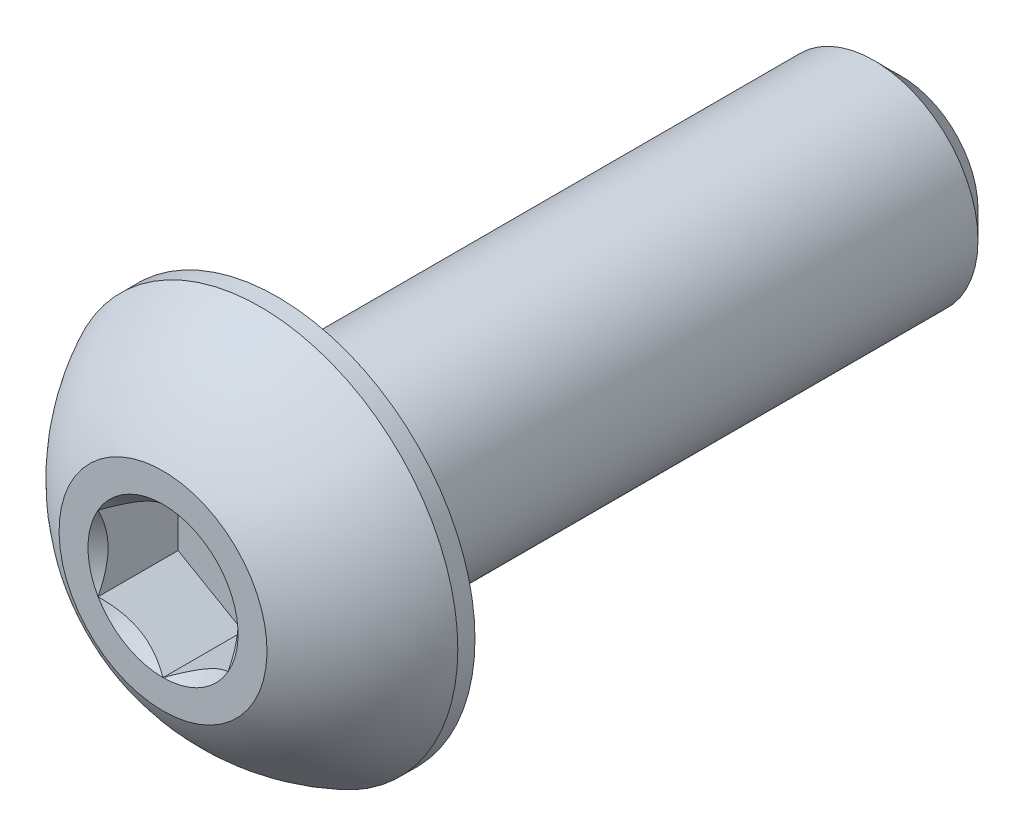
ISO-10303-21;
HEADER;
FILE_DESCRIPTION(('STEP AP214'),'2;1');
FILE_NAME('part.step','',(''),(''),'','','');
FILE_SCHEMA(('AUTOMOTIVE_DESIGN { 1 0 10303 214 1 1 1 1 }'));
ENDSEC;
DATA;
#1=APPLICATION_CONTEXT('core data for automotive mechanical design processes');
#2=APPLICATION_PROTOCOL_DEFINITION('international standard','automotive_design',2000,#1);
#3=PRODUCT_CONTEXT('',#1,'mechanical');
#4=PRODUCT('Part','Part','',(#3));
#5=PRODUCT_RELATED_PRODUCT_CATEGORY('part','',(#4));
#6=PRODUCT_DEFINITION_FORMATION('','',#4);
#7=PRODUCT_DEFINITION_CONTEXT('part definition',#1,'design');
#8=PRODUCT_DEFINITION('design','',#6,#7);
#9=PRODUCT_DEFINITION_SHAPE('','',#8);
#10=(LENGTH_UNIT() NAMED_UNIT(*) SI_UNIT(.MILLI.,.METRE.));
#11=(NAMED_UNIT(*) PLANE_ANGLE_UNIT() SI_UNIT($,.RADIAN.));
#12=(NAMED_UNIT(*) SI_UNIT($,.STERADIAN.) SOLID_ANGLE_UNIT());
#13=UNCERTAINTY_MEASURE_WITH_UNIT(LENGTH_MEASURE(1.E-05),#10,'distance_accuracy_value','');
#14=(GEOMETRIC_REPRESENTATION_CONTEXT(3) GLOBAL_UNCERTAINTY_ASSIGNED_CONTEXT((#13)) GLOBAL_UNIT_ASSIGNED_CONTEXT((#10,
#11,#12)) REPRESENTATION_CONTEXT('',''));
#15=CARTESIAN_POINT('',(0.,0.,0.));
#16=DIRECTION('',(0.,0.,1.));
#17=DIRECTION('',(1.,0.,0.));
#18=AXIS2_PLACEMENT_3D('',#15,#16,#17);
#19=CARTESIAN_POINT('',(0.,0.,-14.2));
#20=DIRECTION('',(0.,0.,1.));
#21=DIRECTION('',(1.,0.,0.));
#22=AXIS2_PLACEMENT_3D('',#19,#20,#21);
#23=PLANE('',#22);
#24=CARTESIAN_POINT('',(0.,0.,-14.2));
#25=DIRECTION('',(0.,0.,1.));
#26=DIRECTION('',(1.,0.,0.));
#27=AXIS2_PLACEMENT_3D('',#24,#25,#26);
#28=CIRCLE('',#27,1.47500000000003);
#29=CARTESIAN_POINT('',(1.47500000000003,0.,-14.2));
#30=VERTEX_POINT('',#29);
#31=EDGE_CURVE('E45',#30,#30,#28,.T.);
#32=ORIENTED_EDGE('',*,*,#31,.F.);
#33=EDGE_LOOP('',(#32));
#34=FACE_BOUND('',#33,.T.);
#35=ADVANCED_FACE('F42',(#34),#23,.F.);
#36=CARTESIAN_POINT('',(0.,0.,-14.2));
#37=DIRECTION('',(0.,0.,1.));
#38=DIRECTION('',(1.,0.,0.));
#39=AXIS2_PLACEMENT_3D('',#36,#37,#38);
#40=CONICAL_SURFACE('',#39,1.47500000000003,0.785398163397435);
#41=CARTESIAN_POINT('',(0.,0.,-13.675));
#42=DIRECTION('',(0.,0.,1.));
#43=DIRECTION('',(1.,0.,0.));
#44=AXIS2_PLACEMENT_3D('',#41,#42,#43);
#45=CIRCLE('',#44,2.00000000000001);
#46=CARTESIAN_POINT('',(2.00000000000001,0.,-13.675));
#47=VERTEX_POINT('',#46);
#48=EDGE_CURVE('E138',#47,#47,#45,.T.);
#49=ORIENTED_EDGE('',*,*,#48,.F.);
#50=EDGE_LOOP('',(#49));
#51=FACE_BOUND('',#50,.T.);
#52=ORIENTED_EDGE('',*,*,#31,.T.);
#53=EDGE_LOOP('',(#52));
#54=FACE_BOUND('',#53,.T.);
#55=ADVANCED_FACE('F159',(#51,#54),#40,.T.);
#56=CARTESIAN_POINT('',(0.,0.,0.));
#57=DIRECTION('',(0.,0.,1.));
#58=DIRECTION('',(1.,0.,0.));
#59=AXIS2_PLACEMENT_3D('',#56,#57,#58);
#60=CYLINDRICAL_SURFACE('',#59,2.00000000000001);
#61=CARTESIAN_POINT('',(0.,0.,-2.2));
#62=DIRECTION('',(0.,0.,1.));
#63=DIRECTION('',(1.,0.,0.));
#64=AXIS2_PLACEMENT_3D('',#61,#62,#63);
#65=CIRCLE('',#64,2.00000000000001);
#66=CARTESIAN_POINT('',(2.00000000000001,0.,-2.2));
#67=VERTEX_POINT('',#66);
#68=EDGE_CURVE('E12',#67,#67,#65,.T.);
#69=ORIENTED_EDGE('',*,*,#68,.F.);
#70=EDGE_LOOP('',(#69));
#71=FACE_BOUND('',#70,.T.);
#72=ORIENTED_EDGE('',*,*,#48,.T.);
#73=EDGE_LOOP('',(#72));
#74=FACE_BOUND('',#73,.T.);
#75=ADVANCED_FACE('F166',(#71,#74),#60,.T.);
#76=CARTESIAN_POINT('',(3.8,0.,-2.2));
#77=DIRECTION('',(0.,0.,-1.));
#78=DIRECTION('',(-1.,0.,0.));
#79=AXIS2_PLACEMENT_3D('',#76,#77,#78);
#80=PLANE('',#79);
#81=ORIENTED_EDGE('',*,*,#68,.T.);
#82=EDGE_LOOP('',(#81));
#83=FACE_BOUND('',#82,.T.);
#84=CARTESIAN_POINT('',(0.,0.,-2.2));
#85=DIRECTION('',(0.,0.,1.));
#86=DIRECTION('',(1.,0.,0.));
#87=AXIS2_PLACEMENT_3D('',#84,#85,#86);
#88=CIRCLE('',#87,3.8);
#89=CARTESIAN_POINT('',(3.8,0.,-2.2));
#90=VERTEX_POINT('',#89);
#91=EDGE_CURVE('E260',#90,#90,#88,.T.);
#92=ORIENTED_EDGE('',*,*,#91,.F.);
#93=EDGE_LOOP('',(#92));
#94=FACE_BOUND('',#93,.T.);
#95=ADVANCED_FACE('F169',(#83,#94),#80,.T.);
#96=CARTESIAN_POINT('',(1.25,-0.721687836487029,-1.54));
#97=DIRECTION('',(0.,0.,1.));
#98=DIRECTION('',(1.,0.,0.));
#99=AXIS2_PLACEMENT_3D('',#96,#97,#98);
#100=PLANE('',#99);
#101=DIRECTION('',(0.866025403784438,0.5,0.));
#102=VECTOR('',#101,1.);
#103=CARTESIAN_POINT('',(0.,-1.44337567297406,-1.54));
#104=LINE('',#103,#102);
#105=CARTESIAN_POINT('',(0.,-1.44337567297406,-1.54));
#106=VERTEX_POINT('',#105);
#107=CARTESIAN_POINT('',(1.25,-0.721687836487029,-1.54));
#108=VERTEX_POINT('',#107);
#109=EDGE_CURVE('E113',#106,#108,#104,.T.);
#110=ORIENTED_EDGE('',*,*,#109,.T.);
#111=DIRECTION('',(0.,1.,0.));
#112=VECTOR('',#111,1.);
#113=CARTESIAN_POINT('',(1.25,-0.721687836487029,-1.54));
#114=LINE('',#113,#112);
#115=CARTESIAN_POINT('',(1.25,0.721687836487031,-1.54));
#116=VERTEX_POINT('',#115);
#117=EDGE_CURVE('E296',#108,#116,#114,.T.);
#118=ORIENTED_EDGE('',*,*,#117,.T.);
#119=DIRECTION('',(-0.866025403784439,0.5,0.));
#120=VECTOR('',#119,1.);
#121=CARTESIAN_POINT('',(1.25,0.721687836487031,-1.54));
#122=LINE('',#121,#120);
#123=CARTESIAN_POINT('',(0.,1.44337567297406,-1.54));
#124=VERTEX_POINT('',#123);
#125=EDGE_CURVE('E292',#116,#124,#122,.T.);
#126=ORIENTED_EDGE('',*,*,#125,.T.);
#127=DIRECTION('',(-0.866025403784439,-0.5,0.));
#128=VECTOR('',#127,1.);
#129=CARTESIAN_POINT('',(0.,1.44337567297406,-1.54));
#130=LINE('',#129,#128);
#131=CARTESIAN_POINT('',(-1.25,0.721687836487031,-1.54));
#132=VERTEX_POINT('',#131);
#133=EDGE_CURVE('E288',#124,#132,#130,.T.);
#134=ORIENTED_EDGE('',*,*,#133,.T.);
#135=DIRECTION('',(0.,-1.,0.));
#136=VECTOR('',#135,1.);
#137=CARTESIAN_POINT('',(-1.25,0.721687836487031,-1.54));
#138=LINE('',#137,#136);
#139=CARTESIAN_POINT('',(-1.25,-0.721687836487032,-1.54));
#140=VERTEX_POINT('',#139);
#141=EDGE_CURVE('E284',#132,#140,#138,.T.);
#142=ORIENTED_EDGE('',*,*,#141,.T.);
#143=DIRECTION('',(0.866025403784439,-0.5,0.));
#144=VECTOR('',#143,1.);
#145=CARTESIAN_POINT('',(-1.25,-0.721687836487032,-1.54));
#146=LINE('',#145,#144);
#147=EDGE_CURVE('E268',#140,#106,#146,.T.);
#148=ORIENTED_EDGE('',*,*,#147,.T.);
#149=EDGE_LOOP('',(#110,#118,#126,#134,#142,#148));
#150=FACE_BOUND('',#149,.T.);
#151=ADVANCED_FACE('F162',(#150),#100,.T.);
#152=CARTESIAN_POINT('',(-1.25,-0.721687836487032,-1.54));
#153=DIRECTION('',(-0.5,-0.866025403784439,0.));
#154=DIRECTION('',(0.866025403784439,-0.5,0.));
#155=AXIS2_PLACEMENT_3D('',#152,#153,#154);
#156=PLANE('',#155);
#157=DIRECTION('',(0.,0.,1.));
#158=VECTOR('',#157,1.);
#159=CARTESIAN_POINT('',(-1.25,-0.721687836487032,-1.54));
#160=LINE('',#159,#158);
#161=CARTESIAN_POINT('',(-1.25,-0.721687836487033,0.));
#162=VERTEX_POINT('',#161);
#163=EDGE_CURVE('E120',#140,#162,#160,.T.);
#164=ORIENTED_EDGE('',*,*,#163,.T.);
#165=CARTESIAN_POINT('',(-1.2502,-0.721572366433194,0.000115483909134937));
#166=CARTESIAN_POINT('',(-1.20722483292841,-0.746384090710444,-0.0246783319448973));
#167=CARTESIAN_POINT('',(-1.16353099525405,-0.771610739653664,-0.0480162655813174));
#168=CARTESIAN_POINT('',(-1.07443406915806,-0.823050873919154,-0.0907479959154642));
#169=CARTESIAN_POINT('',(-1.02902250164293,-0.849269254648332,-0.110118007639587));
#170=CARTESIAN_POINT('',(-0.937452179064738,-0.902137405038635,-0.143299516586524));
#171=CARTESIAN_POINT('',(-0.891316759824113,-0.928773701756386,-0.157194440947345));
#172=CARTESIAN_POINT('',(-0.798029919592406,-0.982632884076012,-0.178602717839362));
#173=CARTESIAN_POINT('',(-0.750881350863619,-1.00985412292348,-0.186132058433214));
#174=CARTESIAN_POINT('',(-0.669626443112746,-1.05676666578643,-0.192925501949298));
#175=CARTESIAN_POINT('',(-0.635625123372058,-1.07639733689152,-0.193931440895651));
#176=CARTESIAN_POINT('',(-0.567682235567521,-1.11562418145499,-0.192238585088682));
#177=CARTESIAN_POINT('',(-0.533740682344341,-1.1352203463451,-0.189538972784462));
#178=CARTESIAN_POINT('',(-0.466185143542499,-1.1742235548576,-0.180591069683623));
#179=CARTESIAN_POINT('',(-0.432571492713224,-1.19363040521232,-0.174339474100295));
#180=CARTESIAN_POINT('',(-0.365905361782186,-1.23212011385119,-0.158624318586096));
#181=CARTESIAN_POINT('',(-0.332853128969703,-1.25120282936279,-0.149159379912542));
#182=CARTESIAN_POINT('',(-0.248200308399735,-1.30007715810653,-0.121068609312415));
#183=CARTESIAN_POINT('',(-0.197133507570361,-1.32956058931202,-0.1003298425478));
#184=CARTESIAN_POINT('',(-0.0969991458867451,-1.38737318998519,-0.0536128653285245));
#185=CARTESIAN_POINT('',(-0.0479256884217308,-1.41570576386268,-0.0276517040532348));
#186=CARTESIAN_POINT('',(0.000199999999999627,-1.4434911430279,0.000115483909135029));
#187=B_SPLINE_CURVE_WITH_KNOTS('',3,(#165,#166,#167,#168,#169,#170,#171,#172,#173,#174,#175,
#176,#177,#178,#179,#180,#181,#182,#183,#184,#185,#186),.UNSPECIFIED.,.F.,.F.,(4,2,2,2,2,2,2,2,
2,2,4),(0.,0.166533409618303,0.334037607289761,0.498880396489697,0.663307919240273,
0.780963963458825,0.898645970148451,1.01643764860773,1.13427993171549,1.32148652032141,
1.50809158792573),.UNSPECIFIED.);
#188=CARTESIAN_POINT('',(0.,-1.44337567297406,0.));
#189=VERTEX_POINT('',#188);
#190=EDGE_CURVE('E102',#162,#189,#187,.T.);
#191=ORIENTED_EDGE('',*,*,#190,.T.);
#192=DIRECTION('',(0.,0.,1.));
#193=VECTOR('',#192,1.);
#194=CARTESIAN_POINT('',(0.,-1.44337567297406,-1.54));
#195=LINE('',#194,#193);
#196=EDGE_CURVE('E119',#106,#189,#195,.T.);
#197=ORIENTED_EDGE('',*,*,#196,.F.);
#198=ORIENTED_EDGE('',*,*,#147,.F.);
#199=EDGE_LOOP('',(#164,#191,#197,#198));
#200=FACE_BOUND('',#199,.T.);
#201=ADVANCED_FACE('F117',(#200),#156,.F.);
#202=CARTESIAN_POINT('',(0.,-1.44337567297406,-1.54));
#203=DIRECTION('',(0.5,-0.866025403784438,0.));
#204=DIRECTION('',(0.866025403784439,0.5,0.));
#205=AXIS2_PLACEMENT_3D('',#202,#203,#204);
#206=PLANE('',#205);
#207=ORIENTED_EDGE('',*,*,#196,.T.);
#208=CARTESIAN_POINT('',(-0.000200000000000326,-1.4434911430279,0.000115483909135025));
#209=CARTESIAN_POINT('',(0.0427751670715863,-1.41867941875065,-0.0246783319448973));
#210=CARTESIAN_POINT('',(0.0864690047459475,-1.39345276980743,-0.0480162655813174));
#211=CARTESIAN_POINT('',(0.175565930841941,-1.34201263554194,-0.0907479959154642));
#212=CARTESIAN_POINT('',(0.220977498357063,-1.31579425481276,-0.110118007639587));
#213=CARTESIAN_POINT('',(0.312547820935259,-1.26292610442246,-0.143299516586524));
#214=CARTESIAN_POINT('',(0.358683240175885,-1.23628980770471,-0.157194440947345));
#215=CARTESIAN_POINT('',(0.451970080407591,-1.18243062538508,-0.178602717839362));
#216=CARTESIAN_POINT('',(0.499118649136378,-1.15520938653761,-0.186132058433214));
#217=CARTESIAN_POINT('',(0.580373556887251,-1.10829684367467,-0.192925501949298));
#218=CARTESIAN_POINT('',(0.614374876627939,-1.08866617256958,-0.193931440895651));
#219=CARTESIAN_POINT('',(0.682317764432476,-1.04943932800611,-0.192238585088682));
#220=CARTESIAN_POINT('',(0.716259317655656,-1.02984316311599,-0.189538972784463));
#221=CARTESIAN_POINT('',(0.783814856457498,-0.990839954603497,-0.180591069683624));
#222=CARTESIAN_POINT('',(0.817428507286773,-0.971433104248769,-0.174339474100296));
#223=CARTESIAN_POINT('',(0.884094638217811,-0.932943395609904,-0.158624318586097));
#224=CARTESIAN_POINT('',(0.917146871030293,-0.913860680098299,-0.149159379912543));
#225=CARTESIAN_POINT('',(1.00179969160026,-0.864986351354566,-0.121068609312415));
#226=CARTESIAN_POINT('',(1.05286649242964,-0.835502920149074,-0.100329842547801));
#227=CARTESIAN_POINT('',(1.15300085411325,-0.777690319475906,-0.0536128653285243));
#228=CARTESIAN_POINT('',(1.20207431157827,-0.749357745598414,-0.0276517040532342));
#229=CARTESIAN_POINT('',(1.2502,-0.721572366433191,0.00011548390913593));
#230=B_SPLINE_CURVE_WITH_KNOTS('',3,(#208,#209,#210,#211,#212,#213,#214,#215,#216,#217,#218,
#219,#220,#221,#222,#223,#224,#225,#226,#227,#228,#229),.UNSPECIFIED.,.F.,.F.,(4,2,2,2,2,2,2,2,
2,2,4),(0.,0.166533409618303,0.334037607289761,0.498880396489697,0.663307919240273,
0.780963963458825,0.898645970148451,1.01643764860773,1.13427993171549,1.32148652032141,
1.50809158792574),.UNSPECIFIED.);
#231=CARTESIAN_POINT('',(1.25,-0.721687836487029,0.));
#232=VERTEX_POINT('',#231);
#233=EDGE_CURVE('E109',#189,#232,#230,.T.);
#234=ORIENTED_EDGE('',*,*,#233,.T.);
#235=DIRECTION('',(0.,0.,1.));
#236=VECTOR('',#235,1.);
#237=CARTESIAN_POINT('',(1.25,-0.721687836487029,-1.54));
#238=LINE('',#237,#236);
#239=EDGE_CURVE('E65',#108,#232,#238,.T.);
#240=ORIENTED_EDGE('',*,*,#239,.F.);
#241=ORIENTED_EDGE('',*,*,#109,.F.);
#242=EDGE_LOOP('',(#207,#234,#240,#241));
#243=FACE_BOUND('',#242,.T.);
#244=ADVANCED_FACE('F124',(#243),#206,.F.);
#245=CARTESIAN_POINT('',(1.25,-0.721687836487029,-1.54));
#246=DIRECTION('',(1.,0.,0.));
#247=DIRECTION('',(0.,0.,-1.));
#248=AXIS2_PLACEMENT_3D('',#245,#246,#247);
#249=PLANE('',#248);
#250=ORIENTED_EDGE('',*,*,#239,.T.);
#251=CARTESIAN_POINT('',(1.25,-1.43934010808076,0.462982096892323));
#252=CARTESIAN_POINT('',(1.25,-1.40429313005658,0.436524922632886));
#253=CARTESIAN_POINT('',(1.25,-1.36905087135598,0.410327160354276));
#254=CARTESIAN_POINT('',(1.25,-1.2980965070631,0.358557571839581));
#255=CARTESIAN_POINT('',(1.25,-1.26238428576495,0.332985904356291));
#256=CARTESIAN_POINT('',(1.25,-1.15390111792707,0.257005993689462));
#257=CARTESIAN_POINT('',(1.25,-1.08031646726264,0.207740286189565));
#258=CARTESIAN_POINT('',(1.25,-0.926012322755091,0.111025830263131));
#259=CARTESIAN_POINT('',(1.25,-0.845125318656143,0.0638412989417957));
#260=CARTESIAN_POINT('',(1.25,-0.679311174076599,-0.0224692656095865));
#261=CARTESIAN_POINT('',(1.25,-0.594398891026685,-0.0616224653730992));
#262=CARTESIAN_POINT('',(1.25,-0.466944812460738,-0.109522776311707));
#263=CARTESIAN_POINT('',(1.25,-0.426289985812819,-0.123270510213663));
#264=CARTESIAN_POINT('',(1.25,-0.343998850091265,-0.147502072549456));
#265=CARTESIAN_POINT('',(1.25,-0.30236247361496,-0.157985676130227));
#266=CARTESIAN_POINT('',(1.25,-0.219052696285663,-0.174969838251702));
#267=CARTESIAN_POINT('',(1.25,-0.177393428474498,-0.18153863952863));
#268=CARTESIAN_POINT('',(1.25,-0.0936293693401902,-0.190564946542239));
#269=CARTESIAN_POINT('',(1.25,-0.0515246558543941,-0.193023159002731));
#270=CARTESIAN_POINT('',(1.25,0.0311890576306333,-0.193645937986714));
#271=CARTESIAN_POINT('',(1.25,0.071796962549932,-0.191962883153752));
#272=CARTESIAN_POINT('',(1.25,0.152668636885198,-0.184731729402085));
#273=CARTESIAN_POINT('',(1.25,0.192932338835359,-0.179182889586891));
#274=CARTESIAN_POINT('',(1.25,0.273499879165296,-0.164428963535045));
#275=CARTESIAN_POINT('',(1.25,0.313792180618512,-0.155161824035893));
#276=CARTESIAN_POINT('',(1.25,0.393496413911458,-0.133463821542651));
#277=CARTESIAN_POINT('',(1.25,0.43290841911506,-0.121033223269353));
#278=CARTESIAN_POINT('',(1.25,0.556992735862299,-0.0772206470685609));
#279=CARTESIAN_POINT('',(1.25,0.639898924666086,-0.0408489271240422));
#280=CARTESIAN_POINT('',(1.25,0.801816555499702,0.0400191621783368));
#281=CARTESIAN_POINT('',(1.25,0.880812666325045,0.084544720911988));
#282=CARTESIAN_POINT('',(1.25,1.0317856127975,0.176404876666627));
#283=CARTESIAN_POINT('',(1.25,1.10391618485086,0.223489933916251));
#284=CARTESIAN_POINT('',(1.25,1.21018606043311,0.29627856159854));
#285=CARTESIAN_POINT('',(1.25,1.24515069969379,0.32079808539336));
#286=CARTESIAN_POINT('',(1.25,1.31460220852737,0.370485636765682));
#287=CARTESIAN_POINT('',(1.25,1.34908920596618,0.395653485415522));
#288=CARTESIAN_POINT('',(1.25,1.38337731682912,0.421090148841215));
#289=B_SPLINE_CURVE_WITH_KNOTS('',3,(#251,#252,#253,#254,#255,#256,#257,#258,#259,#260,#261,
#262,#263,#264,#265,#266,#267,#268,#269,#270,#271,#272,#273,#274,#275,#276,#277,#278,#279,#280,
#281,#282,#283,#284,#285,#286,#287,#288),.UNSPECIFIED.,.F.,.F.,(4,2,2,2,2,2,2,2,2,2,2,2,2,2,2,2,
2,2,4),(0.,0.131732960381447,0.263498984161643,0.529042014455823,0.809741926134614,
1.08947609717225,1.21811634272576,1.346765447839,1.47310084517843,1.59941451973784,
1.72115042167849,1.84290966131734,1.96679153905341,2.09066305366038,2.36146692896008,
2.6332598919849,2.89154668212278,3.01965734507712,3.14773302245627),.UNSPECIFIED.);
#290=CARTESIAN_POINT('',(1.25,0.721687836487029,0.));
#291=VERTEX_POINT('',#290);
#292=EDGE_CURVE('E189',#232,#291,#289,.T.);
#293=ORIENTED_EDGE('',*,*,#292,.T.);
#294=DIRECTION('',(0.,0.,1.));
#295=VECTOR('',#294,1.);
#296=CARTESIAN_POINT('',(1.25,0.721687836487031,-1.54));
#297=LINE('',#296,#295);
#298=EDGE_CURVE('E269',#116,#291,#297,.T.);
#299=ORIENTED_EDGE('',*,*,#298,.F.);
#300=ORIENTED_EDGE('',*,*,#117,.F.);
#301=EDGE_LOOP('',(#250,#293,#299,#300));
#302=FACE_BOUND('',#301,.T.);
#303=ADVANCED_FACE('F234',(#302),#249,.F.);
#304=CARTESIAN_POINT('',(1.25,0.721687836487031,-1.54));
#305=DIRECTION('',(0.5,0.866025403784439,0.));
#306=DIRECTION('',(-0.866025403784439,0.5,0.));
#307=AXIS2_PLACEMENT_3D('',#304,#305,#306);
#308=PLANE('',#307);
#309=ORIENTED_EDGE('',*,*,#298,.T.);
#310=CARTESIAN_POINT('',(1.2502,0.721572366433193,0.000115483909137106));
#311=CARTESIAN_POINT('',(1.20722483292841,0.746384090710443,-0.0246783319448953));
#312=CARTESIAN_POINT('',(1.16353099525405,0.771610739653663,-0.0480162655813155));
#313=CARTESIAN_POINT('',(1.07443406915806,0.823050873919154,-0.0907479959154626));
#314=CARTESIAN_POINT('',(1.02902250164294,0.849269254648332,-0.110118007639585));
#315=CARTESIAN_POINT('',(0.93745217906474,0.902137405038635,-0.143299516586522));
#316=CARTESIAN_POINT('',(0.891316759824114,0.928773701756386,-0.157194440947344));
#317=CARTESIAN_POINT('',(0.798029919592407,0.982632884076012,-0.178602717839361));
#318=CARTESIAN_POINT('',(0.75088135086362,1.00985412292348,-0.186132058433213));
#319=CARTESIAN_POINT('',(0.669626443112747,1.05676666578643,-0.192925501949297));
#320=CARTESIAN_POINT('',(0.635625123372058,1.07639733689152,-0.19393144089565));
#321=CARTESIAN_POINT('',(0.567682235567522,1.11562418145499,-0.192238585088681));
#322=CARTESIAN_POINT('',(0.533740682344342,1.1352203463451,-0.189538972784461));
#323=CARTESIAN_POINT('',(0.4661851435425,1.1742235548576,-0.180591069683622));
#324=CARTESIAN_POINT('',(0.432571492713225,1.19363040521232,-0.174339474100294));
#325=CARTESIAN_POINT('',(0.365905361782186,1.23212011385119,-0.158624318586096));
#326=CARTESIAN_POINT('',(0.332853128969704,1.2512028293628,-0.149159379912542));
#327=CARTESIAN_POINT('',(0.248200308399735,1.30007715810653,-0.121068609312414));
#328=CARTESIAN_POINT('',(0.197133507570362,1.32956058931202,-0.100329842547799));
#329=CARTESIAN_POINT('',(0.0969991458867455,1.38737318998519,-0.0536128653285237));
#330=CARTESIAN_POINT('',(0.0479256884217311,1.41570576386268,-0.0276517040532341));
#331=CARTESIAN_POINT('',(-0.000199999999999383,1.4434911430279,0.000115483909135572));
#332=B_SPLINE_CURVE_WITH_KNOTS('',3,(#310,#311,#312,#313,#314,#315,#316,#317,#318,#319,#320,
#321,#322,#323,#324,#325,#326,#327,#328,#329,#330,#331),.UNSPECIFIED.,.F.,.F.,(4,2,2,2,2,2,2,2,
2,2,4),(0.,0.166533409618304,0.334037607289762,0.498880396489699,0.663307919240276,
0.780963963458828,0.898645970148454,1.01643764860773,1.1342799317155,1.32148652032141,
1.50809158792573),.UNSPECIFIED.);
#333=CARTESIAN_POINT('',(0.,1.44337567297406,0.));
#334=VERTEX_POINT('',#333);
#335=EDGE_CURVE('E143',#291,#334,#332,.T.);
#336=ORIENTED_EDGE('',*,*,#335,.T.);
#337=DIRECTION('',(0.,0.,1.));
#338=VECTOR('',#337,1.);
#339=CARTESIAN_POINT('',(0.,1.44337567297406,-1.54));
#340=LINE('',#339,#338);
#341=EDGE_CURVE('E273',#124,#334,#340,.T.);
#342=ORIENTED_EDGE('',*,*,#341,.F.);
#343=ORIENTED_EDGE('',*,*,#125,.F.);
#344=EDGE_LOOP('',(#309,#336,#342,#343));
#345=FACE_BOUND('',#344,.T.);
#346=ADVANCED_FACE('F230',(#345),#308,.F.);
#347=CARTESIAN_POINT('',(0.,1.44337567297406,-1.54));
#348=DIRECTION('',(-0.5,0.866025403784438,0.));
#349=DIRECTION('',(-0.866025403784439,-0.5,0.));
#350=AXIS2_PLACEMENT_3D('',#347,#348,#349);
#351=PLANE('',#350);
#352=ORIENTED_EDGE('',*,*,#341,.T.);
#353=CARTESIAN_POINT('',(0.000200000000000433,1.4434911430279,0.000115483909135892));
#354=CARTESIAN_POINT('',(-0.0427751670715862,1.41867941875065,-0.0246783319448965));
#355=CARTESIAN_POINT('',(-0.0864690047459474,1.39345276980743,-0.0480162655813166));
#356=CARTESIAN_POINT('',(-0.175565930841941,1.34201263554194,-0.0907479959154634));
#357=CARTESIAN_POINT('',(-0.220977498357063,1.31579425481276,-0.110118007639586));
#358=CARTESIAN_POINT('',(-0.312547820935259,1.26292610442246,-0.143299516586523));
#359=CARTESIAN_POINT('',(-0.358683240175885,1.23628980770471,-0.157194440947344));
#360=CARTESIAN_POINT('',(-0.451970080407591,1.18243062538508,-0.178602717839361));
#361=CARTESIAN_POINT('',(-0.499118649136379,1.15520938653761,-0.186132058433213));
#362=CARTESIAN_POINT('',(-0.580373556887251,1.10829684367467,-0.192925501949298));
#363=CARTESIAN_POINT('',(-0.61437487662794,1.08866617256958,-0.193931440895651));
#364=CARTESIAN_POINT('',(-0.682317764432476,1.04943932800611,-0.192238585088682));
#365=CARTESIAN_POINT('',(-0.716259317655656,1.02984316311599,-0.189538972784462));
#366=CARTESIAN_POINT('',(-0.783814856457498,0.990839954603498,-0.180591069683623));
#367=CARTESIAN_POINT('',(-0.817428507286774,0.97143310424877,-0.174339474100295));
#368=CARTESIAN_POINT('',(-0.884094638217812,0.932943395609904,-0.158624318586097));
#369=CARTESIAN_POINT('',(-0.917146871030294,0.913860680098299,-0.149159379912542));
#370=CARTESIAN_POINT('',(-1.00179969160026,0.864986351354567,-0.121068609312415));
#371=CARTESIAN_POINT('',(-1.05286649242964,0.835502920149075,-0.1003298425478));
#372=CARTESIAN_POINT('',(-1.15300085411325,0.777690319475907,-0.0536128653285245));
#373=CARTESIAN_POINT('',(-1.20207431157827,0.749357745598416,-0.0276517040532348));
#374=CARTESIAN_POINT('',(-1.2502,0.721572366433194,0.000115483909135054));
#375=B_SPLINE_CURVE_WITH_KNOTS('',3,(#353,#354,#355,#356,#357,#358,#359,#360,#361,#362,#363,
#364,#365,#366,#367,#368,#369,#370,#371,#372,#373,#374),.UNSPECIFIED.,.F.,.F.,(4,2,2,2,2,2,2,2,
2,2,4),(0.,0.166533409618303,0.334037607289761,0.498880396489697,0.663307919240274,
0.780963963458826,0.898645970148452,1.01643764860773,1.13427993171549,1.32148652032141,
1.50809158792573),.UNSPECIFIED.);
#376=CARTESIAN_POINT('',(-1.25,0.721687836487031,0.));
#377=VERTEX_POINT('',#376);
#378=EDGE_CURVE('E199',#334,#377,#375,.T.);
#379=ORIENTED_EDGE('',*,*,#378,.T.);
#380=DIRECTION('',(0.,0.,1.));
#381=VECTOR('',#380,1.);
#382=CARTESIAN_POINT('',(-1.25,0.721687836487031,-1.54));
#383=LINE('',#382,#381);
#384=EDGE_CURVE('E277',#132,#377,#383,.T.);
#385=ORIENTED_EDGE('',*,*,#384,.F.);
#386=ORIENTED_EDGE('',*,*,#133,.F.);
#387=EDGE_LOOP('',(#352,#379,#385,#386));
#388=FACE_BOUND('',#387,.T.);
#389=ADVANCED_FACE('F226',(#388),#351,.F.);
#390=CARTESIAN_POINT('',(-1.25,0.721687836487031,-1.54));
#391=DIRECTION('',(-1.,0.,0.));
#392=DIRECTION('',(0.,-1.,0.));
#393=AXIS2_PLACEMENT_3D('',#390,#391,#392);
#394=PLANE('',#393);
#395=ORIENTED_EDGE('',*,*,#384,.T.);
#396=CARTESIAN_POINT('',(-1.25,-1.43934010808077,0.462982096892325));
#397=CARTESIAN_POINT('',(-1.25,-1.40429313005658,0.436524922632887));
#398=CARTESIAN_POINT('',(-1.25,-1.36905087135599,0.410327160354277));
#399=CARTESIAN_POINT('',(-1.25,-1.29809650706311,0.358557571839583));
#400=CARTESIAN_POINT('',(-1.25,-1.26238428576495,0.332985904356292));
#401=CARTESIAN_POINT('',(-1.25,-1.15390111792708,0.257005993689462));
#402=CARTESIAN_POINT('',(-1.25,-1.08031646726264,0.207740286189565));
#403=CARTESIAN_POINT('',(-1.25,-0.926012322755094,0.11102583026313));
#404=CARTESIAN_POINT('',(-1.25,-0.845125318656146,0.0638412989417953));
#405=CARTESIAN_POINT('',(-1.25,-0.679311174076601,-0.0224692656095875));
#406=CARTESIAN_POINT('',(-1.25,-0.594398891026687,-0.0616224653731005));
#407=CARTESIAN_POINT('',(-1.25,-0.46694481246074,-0.109522776311709));
#408=CARTESIAN_POINT('',(-1.25,-0.426289985812821,-0.123270510213665));
#409=CARTESIAN_POINT('',(-1.25,-0.343998850091267,-0.147502072549458));
#410=CARTESIAN_POINT('',(-1.25,-0.302362473614962,-0.157985676130229));
#411=CARTESIAN_POINT('',(-1.25,-0.219052696285665,-0.174969838251704));
#412=CARTESIAN_POINT('',(-1.25,-0.1773934284745,-0.181538639528632));
#413=CARTESIAN_POINT('',(-1.25,-0.0936293693401922,-0.190564946542242));
#414=CARTESIAN_POINT('',(-1.25,-0.051524655854396,-0.193023159002733));
#415=CARTESIAN_POINT('',(-1.25,0.0311890576306315,-0.193645937986716));
#416=CARTESIAN_POINT('',(-1.25,0.0717969625499304,-0.191962883153754));
#417=CARTESIAN_POINT('',(-1.25,0.152668636885197,-0.184731729402088));
#418=CARTESIAN_POINT('',(-1.25,0.192932338835358,-0.179182889586893));
#419=CARTESIAN_POINT('',(-1.25,0.273499879165295,-0.164428963535048));
#420=CARTESIAN_POINT('',(-1.25,0.313792180618511,-0.155161824035896));
#421=CARTESIAN_POINT('',(-1.25,0.393496413911457,-0.133463821542654));
#422=CARTESIAN_POINT('',(-1.25,0.432908419115058,-0.121033223269356));
#423=CARTESIAN_POINT('',(-1.25,0.556992735862297,-0.0772206470685636));
#424=CARTESIAN_POINT('',(-1.25,0.639898924666085,-0.0408489271240449));
#425=CARTESIAN_POINT('',(-1.25,0.8018165554997,0.040019162178334));
#426=CARTESIAN_POINT('',(-1.25,0.880812666325043,0.084544720911985));
#427=CARTESIAN_POINT('',(-1.25,1.0317856127975,0.176404876666624));
#428=CARTESIAN_POINT('',(-1.25,1.10391618485086,0.223489933916248));
#429=CARTESIAN_POINT('',(-1.25,1.2101860604331,0.296278561598537));
#430=CARTESIAN_POINT('',(-1.25,1.24515069969379,0.320798085393357));
#431=CARTESIAN_POINT('',(-1.25,1.31460220852736,0.370485636765679));
#432=CARTESIAN_POINT('',(-1.25,1.34908920596618,0.395653485415518));
#433=CARTESIAN_POINT('',(-1.25,1.38337731682911,0.421090148841212));
#434=B_SPLINE_CURVE_WITH_KNOTS('',3,(#396,#397,#398,#399,#400,#401,#402,#403,#404,#405,#406,
#407,#408,#409,#410,#411,#412,#413,#414,#415,#416,#417,#418,#419,#420,#421,#422,#423,#424,#425,
#426,#427,#428,#429,#430,#431,#432,#433),.UNSPECIFIED.,.F.,.F.,(4,2,2,2,2,2,2,2,2,2,2,2,2,2,2,2,
2,2,4),(0.,0.131732960381448,0.263498984161644,0.529042014455824,0.809741926134617,
1.08947609717225,1.21811634272576,1.346765447839,1.47310084517844,1.59941451973784,
1.72115042167849,1.84290966131735,1.96679153905341,2.09066305366039,2.36146692896009,
2.63325989198491,2.89154668212279,3.01965734507712,3.14773302245628),.UNSPECIFIED.);
#435=EDGE_CURVE('E122',#377,#162,#434,.F.);
#436=ORIENTED_EDGE('',*,*,#435,.T.);
#437=ORIENTED_EDGE('',*,*,#163,.F.);
#438=ORIENTED_EDGE('',*,*,#141,.F.);
#439=EDGE_LOOP('',(#395,#436,#437,#438));
#440=FACE_BOUND('',#439,.T.);
#441=ADVANCED_FACE('F223',(#440),#394,.F.);
#442=CARTESIAN_POINT('',(0.,0.,0.));
#443=DIRECTION('',(0.,0.,1.));
#444=DIRECTION('',(1.,0.,0.));
#445=AXIS2_PLACEMENT_3D('',#442,#443,#444);
#446=CONICAL_SURFACE('',#445,1.44337567297406,0.78539816339745);
#447=CARTESIAN_POINT('',(0.,0.,0.));
#448=DIRECTION('',(0.,0.,1.));
#449=DIRECTION('',(1.,0.,0.));
#450=AXIS2_PLACEMENT_3D('',#447,#448,#449);
#451=CIRCLE('',#450,1.44337567297406);
#452=EDGE_CURVE('E99',#162,#189,#451,.T.);
#453=ORIENTED_EDGE('',*,*,#452,.T.);
#454=ORIENTED_EDGE('',*,*,#190,.F.);
#455=EDGE_LOOP('',(#453,#454));
#456=FACE_BOUND('',#455,.T.);
#457=ADVANCED_FACE('F100',(#456),#446,.F.);
#458=EDGE_CURVE('E57',#189,#232,#451,.T.);
#459=ORIENTED_EDGE('',*,*,#458,.T.);
#460=ORIENTED_EDGE('',*,*,#233,.F.);
#461=EDGE_LOOP('',(#459,#460));
#462=FACE_BOUND('',#461,.T.);
#463=ADVANCED_FACE('F110',(#462),#446,.F.);
#464=EDGE_CURVE('E135',#232,#291,#451,.T.);
#465=ORIENTED_EDGE('',*,*,#464,.T.);
#466=ORIENTED_EDGE('',*,*,#292,.F.);
#467=EDGE_LOOP('',(#465,#466));
#468=FACE_BOUND('',#467,.T.);
#469=ADVANCED_FACE('F184',(#468),#446,.F.);
#470=EDGE_CURVE('E139',#291,#334,#451,.T.);
#471=ORIENTED_EDGE('',*,*,#470,.T.);
#472=ORIENTED_EDGE('',*,*,#335,.F.);
#473=EDGE_LOOP('',(#471,#472));
#474=FACE_BOUND('',#473,.T.);
#475=ADVANCED_FACE('F322',(#474),#446,.F.);
#476=EDGE_CURVE('E142',#334,#377,#451,.T.);
#477=ORIENTED_EDGE('',*,*,#476,.T.);
#478=ORIENTED_EDGE('',*,*,#378,.F.);
#479=EDGE_LOOP('',(#477,#478));
#480=FACE_BOUND('',#479,.T.);
#481=ADVANCED_FACE('F318',(#480),#446,.F.);
#482=EDGE_CURVE('E107',#377,#162,#451,.T.);
#483=ORIENTED_EDGE('',*,*,#482,.T.);
#484=ORIENTED_EDGE('',*,*,#435,.F.);
#485=EDGE_LOOP('',(#483,#484));
#486=FACE_BOUND('',#485,.T.);
#487=ADVANCED_FACE('F248',(#486),#446,.F.);
#488=CARTESIAN_POINT('',(0.,-2.00000000000001,0.));
#489=DIRECTION('',(0.,0.,-1.));
#490=DIRECTION('',(-1.,0.,0.));
#491=AXIS2_PLACEMENT_3D('',#488,#489,#490);
#492=PLANE('',#491);
#493=ORIENTED_EDGE('',*,*,#482,.F.);
#494=ORIENTED_EDGE('',*,*,#476,.F.);
#495=ORIENTED_EDGE('',*,*,#470,.F.);
#496=ORIENTED_EDGE('',*,*,#464,.F.);
#497=ORIENTED_EDGE('',*,*,#458,.F.);
#498=ORIENTED_EDGE('',*,*,#452,.F.);
#499=EDGE_LOOP('',(#493,#494,#495,#496,#497,#498));
#500=FACE_BOUND('',#499,.T.);
#501=CARTESIAN_POINT('',(0.,0.,0.));
#502=DIRECTION('',(0.,0.,1.));
#503=DIRECTION('',(1.,0.,0.));
#504=AXIS2_PLACEMENT_3D('',#501,#502,#503);
#505=CIRCLE('',#504,2.00000000000001);
#506=CARTESIAN_POINT('',(0.,-2.00000000000001,0.));
#507=VERTEX_POINT('',#506);
#508=EDGE_CURVE('E256',#507,#507,#505,.T.);
#509=ORIENTED_EDGE('',*,*,#508,.T.);
#510=EDGE_LOOP('',(#509));
#511=FACE_BOUND('',#510,.T.);
#512=ADVANCED_FACE('F131',(#500,#511),#492,.F.);
#513=CARTESIAN_POINT('',(0.,0.,-3.72644385026738));
#514=DIRECTION('',(0.,0.,1.));
#515=DIRECTION('',(0.,-1.,0.));
#516=AXIS2_PLACEMENT_3D('',#513,#514,#515);
#517=SPHERICAL_SURFACE('',#516,4.22922968981299);
#518=CARTESIAN_POINT('',(0.,0.,-1.87));
#519=DIRECTION('',(0.,0.,1.));
#520=DIRECTION('',(1.,0.,0.));
#521=AXIS2_PLACEMENT_3D('',#518,#519,#520);
#522=CIRCLE('',#521,3.8);
#523=CARTESIAN_POINT('',(0.,-3.8,-1.87));
#524=VERTEX_POINT('',#523);
#525=EDGE_CURVE('E128',#524,#524,#522,.T.);
#526=CARTESIAN_POINT('',(0.,-2.00000000000001,0.));
#527=CARTESIAN_POINT('',(0.,-2.02421343985615,-0.0129954259644869));
#528=CARTESIAN_POINT('',(0.,-2.04830018323976,-0.0262269129651298));
#529=CARTESIAN_POINT('',(0.,-2.09621120342127,-0.0531568415057489));
#530=CARTESIAN_POINT('',(0.,-2.12003548021918,-0.0668552830457251));
#531=CARTESIAN_POINT('',(0.,-2.16741249358868,-0.0947139531320313));
#532=CARTESIAN_POINT('',(0.,-2.19096523016027,-0.108874181678362));
#533=CARTESIAN_POINT('',(0.,-2.23779021933684,-0.137651035235957));
#534=CARTESIAN_POINT('',(0.,-2.26106247194182,-0.152267660247222));
#535=CARTESIAN_POINT('',(0.,-2.30731764886073,-0.181951755514141));
#536=CARTESIAN_POINT('',(0.,-2.33030057317466,-0.197019225769796));
#537=CARTESIAN_POINT('',(0.,-2.37596836104236,-0.227599285582871));
#538=CARTESIAN_POINT('',(0.,-2.39865322459613,-0.243111875140292));
#539=CARTESIAN_POINT('',(0.,-2.44371627121514,-0.274576279395883));
#540=CARTESIAN_POINT('',(0.,-2.46609445428039,-0.290528094094054));
#541=CARTESIAN_POINT('',(0.,-2.51053563686182,-0.322864887331673));
#542=CARTESIAN_POINT('',(0.,-2.53259863637801,-0.339249865871121));
#543=CARTESIAN_POINT('',(0.,-2.57640106852493,-0.372446760967232));
#544=CARTESIAN_POINT('',(0.,-2.59814050115565,-0.389258677523893));
#545=CARTESIAN_POINT('',(0.,-2.64128753915154,-0.423303060588149));
#546=CARTESIAN_POINT('',(0.,-2.66269514451672,-0.440535527095743));
#547=CARTESIAN_POINT('',(0.,-2.70517039368396,-0.475414462202968));
#548=CARTESIAN_POINT('',(0.,-2.72623803748603,-0.493060930802598));
#549=CARTESIAN_POINT('',(0.,-2.76802535840619,-0.52876116492441));
#550=CARTESIAN_POINT('',(0.,-2.78874503552429,-0.546814930446591));
#551=CARTESIAN_POINT('',(0.,-2.82982855017314,-0.583322898482808));
#552=CARTESIAN_POINT('',(0.,-2.8501923877039,-0.601777100996845));
#553=CARTESIAN_POINT('',(0.,-2.89055648548395,-0.639078930931024));
#554=CARTESIAN_POINT('',(0.,-2.91055674573325,-0.657926558351167));
#555=CARTESIAN_POINT('',(0.,-2.95018608940553,-0.696008076521268));
#556=CARTESIAN_POINT('',(0.,-2.96981517282853,-0.715241967271226));
#557=CARTESIAN_POINT('',(0.,-3.00869470434028,-0.754088703755296));
#558=CARTESIAN_POINT('',(0.,-3.02794515242904,-0.773701549489407));
#559=CARTESIAN_POINT('',(0.,-3.06606009863533,-0.813298743603727));
#560=CARTESIAN_POINT('',(0.,-3.08492459675287,-0.833283091983936));
#561=CARTESIAN_POINT('',(0.,-3.12226047503003,-0.873615697891679));
#562=CARTESIAN_POINT('',(0.,-3.14073185518965,-0.893963955419214));
#563=CARTESIAN_POINT('',(0.,-3.17727447893822,-0.935016647847444));
#564=CARTESIAN_POINT('',(0.,-3.19534572252716,-0.95572108274814));
#565=CARTESIAN_POINT('',(0.,-3.23108120656243,-0.99747826281099));
#566=CARTESIAN_POINT('',(0.,-3.24874544700875,-1.01853100797314));
#567=CARTESIAN_POINT('',(0.,-3.28366021283673,-1.06097680909897));
#568=CARTESIAN_POINT('',(0.,-3.30091073821839,-1.08236986506264));
#569=CARTESIAN_POINT('',(0.,-3.33499151919534,-1.12548815902284));
#570=CARTESIAN_POINT('',(0.,-3.35182177479064,-1.14721339701936));
#571=CARTESIAN_POINT('',(0.,-3.38505562116372,-1.1909878000568));
#572=CARTESIAN_POINT('',(0.,-3.40145921194149,-1.21303696509771));
#573=CARTESIAN_POINT('',(0.,-3.43383349577047,-1.25745084415152));
#574=CARTESIAN_POINT('',(0.,-3.44980418882167,-1.27981555816441));
#575=CARTESIAN_POINT('',(0.,-3.48130660877275,-1.32485203719233));
#576=CARTESIAN_POINT('',(0.,-3.49683833567264,-1.34752380220736));
#577=CARTESIAN_POINT('',(0.,-3.52745692170932,-1.39316576858967));
#578=CARTESIAN_POINT('',(0.,-3.5425437808461,-1.41613596995695));
#579=CARTESIAN_POINT('',(0.,-3.57226689871518,-1.46236608103065));
#580=CARTESIAN_POINT('',(0.,-3.58690315744748,-1.48562599073709));
#581=CARTESIAN_POINT('',(0.,-3.615719513332,-1.5324266802666));
#582=CARTESIAN_POINT('',(0.,-3.62989961048422,-1.55596746008967));
#583=CARTESIAN_POINT('',(0.,-3.65779825442823,-1.6033209453859));
#584=CARTESIAN_POINT('',(0.,-3.67151680122002,-1.62713365085906));
#585=CARTESIAN_POINT('',(0.,-3.69848713452322,-1.67502193787766));
#586=CARTESIAN_POINT('',(0.,-3.71173892103461,-1.6990975194231));
#587=CARTESIAN_POINT('',(0.,-3.73777068821038,-1.74750241579215));
#588=CARTESIAN_POINT('',(0.,-3.75055066887474,-1.77183173061575));
#589=CARTESIAN_POINT('',(0.,-3.77563400658953,-1.82073482944519));
#590=CARTESIAN_POINT('',(0.,-3.78793736363997,-1.84530861345103));
#591=CARTESIAN_POINT('',(0.,-3.8,-1.87));
#592=B_SPLINE_CURVE_WITH_KNOTS('',3,(#526,#527,#528,#529,#530,#531,#532,#533,#534,#535,#536,
#537,#538,#539,#540,#541,#542,#543,#544,#545,#546,#547,#548,#549,#550,#551,#552,#553,#554,#555,
#556,#557,#558,#559,#560,#561,#562,#563,#564,#565,#566,#567,#568,#569,#570,#571,#572,#573,#574,
#575,#576,#577,#578,#579,#580,#581,#582,#583,#584,#585,#586,#587,#588,#589,#590,#591),
.UNSPECIFIED.,.F.,.F.,(4,2,2,2,2,2,2,2,2,2,2,2,2,2,2,2,2,2,2,2,2,2,2,2,2,2,2,2,2,2,2,2,4),(0.,
0.0824398589102638,0.164879717820528,0.247319576730792,0.329759435641056,0.41219929455132,
0.494639153461583,0.577079012371847,0.659518871282112,0.741958730192376,0.82439858910264,
0.906838448012904,0.989278306923168,1.07171816583343,1.1541580247437,1.23659788365396,
1.31903774256422,1.40147760147449,1.48391746038475,1.56635731929502,1.64879717820528,
1.73123703711554,1.81367689602581,1.89611675493607,1.97855661384634,2.0609964727566,
2.14343633166686,2.22587619057713,2.30831604948739,2.39075590839766,2.47319576730792,
2.55563562621818,2.63807548512845),.UNSPECIFIED.);
#593=EDGE_CURVE('BSEAM244',#507,#524,#592,.T.);
#594=ORIENTED_EDGE('',*,*,#508,.F.);
#595=ORIENTED_EDGE('',*,*,#525,.T.);
#596=ORIENTED_EDGE('',*,*,#593,.T.);
#597=ORIENTED_EDGE('',*,*,#593,.F.);
#598=EDGE_LOOP('',(#594,#596,#595,#597));
#599=FACE_BOUND('',#598,.T.);
#600=ADVANCED_FACE('F244',(#599),#517,.T.);
#601=CARTESIAN_POINT('',(0.,0.,0.));
#602=DIRECTION('',(0.,0.,1.));
#603=DIRECTION('',(1.,0.,0.));
#604=AXIS2_PLACEMENT_3D('',#601,#602,#603);
#605=CYLINDRICAL_SURFACE('',#604,3.8);
#606=ORIENTED_EDGE('',*,*,#525,.F.);
#607=EDGE_LOOP('',(#606));
#608=FACE_BOUND('',#607,.T.);
#609=ORIENTED_EDGE('',*,*,#91,.T.);
#610=EDGE_LOOP('',(#609));
#611=FACE_BOUND('',#610,.T.);
#612=ADVANCED_FACE('F180',(#608,#611),#605,.T.);
#613=CLOSED_SHELL('',(#35,#55,#75,#95,#151,#201,#244,#303,#346,#389,#441,#457,#463,#469,#475,
#481,#487,#512,#600,#612));
#614=MANIFOLD_SOLID_BREP('B2',#613);
#615=ADVANCED_BREP_SHAPE_REPRESENTATION('',(#18,#614),#14);
#616=SHAPE_DEFINITION_REPRESENTATION(#9,#615);
ENDSEC;
END-ISO-10303-21;
